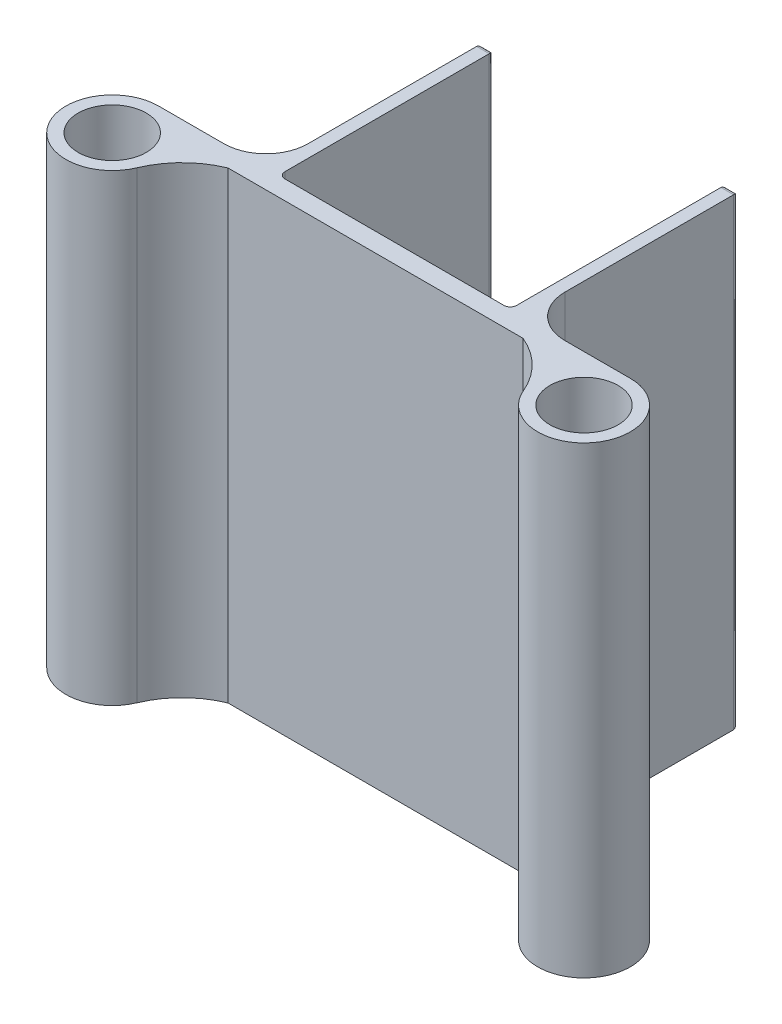
ISO-10303-21;
HEADER;
FILE_DESCRIPTION(('STEP AP214'),'2;1');
FILE_NAME('part.step','',(''),(''),'','','');
FILE_SCHEMA(('AUTOMOTIVE_DESIGN { 1 0 10303 214 1 1 1 1 }'));
ENDSEC;
DATA;
#1=APPLICATION_CONTEXT('core data for automotive mechanical design processes');
#2=APPLICATION_PROTOCOL_DEFINITION('international standard','automotive_design',2000,#1);
#3=PRODUCT_CONTEXT('',#1,'mechanical');
#4=PRODUCT('Part','Part','',(#3));
#5=PRODUCT_RELATED_PRODUCT_CATEGORY('part','',(#4));
#6=PRODUCT_DEFINITION_FORMATION('','',#4);
#7=PRODUCT_DEFINITION_CONTEXT('part definition',#1,'design');
#8=PRODUCT_DEFINITION('design','',#6,#7);
#9=PRODUCT_DEFINITION_SHAPE('','',#8);
#10=(LENGTH_UNIT() NAMED_UNIT(*) SI_UNIT(.MILLI.,.METRE.));
#11=(NAMED_UNIT(*) PLANE_ANGLE_UNIT() SI_UNIT($,.RADIAN.));
#12=(NAMED_UNIT(*) SI_UNIT($,.STERADIAN.) SOLID_ANGLE_UNIT());
#13=UNCERTAINTY_MEASURE_WITH_UNIT(LENGTH_MEASURE(1.E-05),#10,'distance_accuracy_value','');
#14=(GEOMETRIC_REPRESENTATION_CONTEXT(3) GLOBAL_UNCERTAINTY_ASSIGNED_CONTEXT((#13)) GLOBAL_UNIT_ASSIGNED_CONTEXT((#10,
#11,#12)) REPRESENTATION_CONTEXT('',''));
#15=CARTESIAN_POINT('',(0.,0.,0.));
#16=DIRECTION('',(0.,0.,1.));
#17=DIRECTION('',(1.,0.,0.));
#18=AXIS2_PLACEMENT_3D('',#15,#16,#17);
#19=CARTESIAN_POINT('',(0.,130.,-11.));
#20=DIRECTION('',(0.,0.,-1.));
#21=DIRECTION('',(-1.,0.,0.));
#22=AXIS2_PLACEMENT_3D('',#19,#20,#21);
#23=PLANE('',#22);
#24=DIRECTION('',(-1.,0.,0.));
#25=VECTOR('',#24,1.);
#26=CARTESIAN_POINT('',(49.2651427330391,121.,-11.));
#27=LINE('',#26,#25);
#28=CARTESIAN_POINT('',(19.2651427330391,121.,-11.));
#29=VERTEX_POINT('',#28);
#30=CARTESIAN_POINT('',(-32.7348572669609,121.,-11.));
#31=VERTEX_POINT('',#30);
#32=EDGE_CURVE('E256',#29,#31,#27,.T.);
#33=ORIENTED_EDGE('',*,*,#32,.F.);
#34=DIRECTION('',(0.,1.,0.));
#35=VECTOR('',#34,1.);
#36=CARTESIAN_POINT('',(19.2651427330391,130.,-11.));
#37=LINE('',#36,#35);
#38=CARTESIAN_POINT('',(19.2651427330391,11.,-11.));
#39=VERTEX_POINT('',#38);
#40=EDGE_CURVE('E309',#29,#39,#37,.F.);
#41=ORIENTED_EDGE('',*,*,#40,.T.);
#42=DIRECTION('',(1.,0.,0.));
#43=VECTOR('',#42,1.);
#44=CARTESIAN_POINT('',(-62.7348572669609,11.,-11.));
#45=LINE('',#44,#43);
#46=CARTESIAN_POINT('',(-32.7348572669609,11.,-11.));
#47=VERTEX_POINT('',#46);
#48=EDGE_CURVE('E237',#47,#39,#45,.T.);
#49=ORIENTED_EDGE('',*,*,#48,.F.);
#50=DIRECTION('',(0.,-1.,0.));
#51=VECTOR('',#50,1.);
#52=CARTESIAN_POINT('',(-32.7348572669609,130.,-11.));
#53=LINE('',#52,#51);
#54=EDGE_CURVE('E306',#47,#31,#53,.F.);
#55=ORIENTED_EDGE('',*,*,#54,.T.);
#56=EDGE_LOOP('',(#33,#41,#49,#55));
#57=FACE_BOUND('',#56,.T.);
#58=ADVANCED_FACE('F43',(#57),#23,.T.);
#59=CARTESIAN_POINT('',(-47.2348572669609,121.,-11.));
#60=VERTEX_POINT('',#59);
#61=CARTESIAN_POINT('',(-62.7348572669609,121.,-11.));
#62=VERTEX_POINT('',#61);
#63=EDGE_CURVE('E250',#60,#62,#27,.T.);
#64=ORIENTED_EDGE('',*,*,#63,.F.);
#65=DIRECTION('',(0.,-1.,0.));
#66=VECTOR('',#65,1.);
#67=CARTESIAN_POINT('',(-47.2348572669609,11.,-11.));
#68=LINE('',#67,#66);
#69=CARTESIAN_POINT('',(-47.2348572669609,11.,-11.));
#70=VERTEX_POINT('',#69);
#71=EDGE_CURVE('E272',#60,#70,#68,.T.);
#72=ORIENTED_EDGE('',*,*,#71,.T.);
#73=CARTESIAN_POINT('',(-62.7348572669609,11.,-11.));
#74=VERTEX_POINT('',#73);
#75=EDGE_CURVE('E232',#74,#70,#45,.T.);
#76=ORIENTED_EDGE('',*,*,#75,.F.);
#77=DIRECTION('',(0.,-1.,0.));
#78=VECTOR('',#77,1.);
#79=CARTESIAN_POINT('',(-62.7348572669609,130.,-11.));
#80=LINE('',#79,#78);
#81=EDGE_CURVE('E255',#62,#74,#80,.T.);
#82=ORIENTED_EDGE('',*,*,#81,.F.);
#83=EDGE_LOOP('',(#64,#72,#76,#82));
#84=FACE_BOUND('',#83,.T.);
#85=ADVANCED_FACE('F487',(#84),#23,.T.);
#86=CARTESIAN_POINT('',(-62.7348572669609,121.,0.));
#87=DIRECTION('',(0.,1.,0.));
#88=DIRECTION('',(0.,0.,1.));
#89=AXIS2_PLACEMENT_3D('',#86,#87,#88);
#90=PLANE('',#89);
#91=CARTESIAN_POINT('',(-62.7348572669609,121.,0.));
#92=DIRECTION('',(0.,1.,0.));
#93=DIRECTION('',(0.,0.,1.));
#94=AXIS2_PLACEMENT_3D('',#91,#92,#93);
#95=CIRCLE('',#94,8.1);
#96=CARTESIAN_POINT('',(-62.7348572669609,121.,8.1));
#97=VERTEX_POINT('',#96);
#98=EDGE_CURVE('E207',#97,#97,#95,.T.);
#99=ORIENTED_EDGE('',*,*,#98,.F.);
#100=EDGE_LOOP('',(#99));
#101=FACE_BOUND('',#100,.T.);
#102=CARTESIAN_POINT('',(49.2651427330391,121.,0.));
#103=DIRECTION('',(0.,1.,0.));
#104=DIRECTION('',(0.,0.,1.));
#105=AXIS2_PLACEMENT_3D('',#102,#103,#104);
#106=CIRCLE('',#105,8.1);
#107=CARTESIAN_POINT('',(49.2651427330391,121.,8.1));
#108=VERTEX_POINT('',#107);
#109=EDGE_CURVE('E432',#108,#108,#106,.T.);
#110=ORIENTED_EDGE('',*,*,#109,.F.);
#111=EDGE_LOOP('',(#110));
#112=FACE_BOUND('',#111,.T.);
#113=DIRECTION('',(0.,0.,1.));
#114=VECTOR('',#113,1.);
#115=CARTESIAN_POINT('',(-34.2348572669609,121.,-62.));
#116=LINE('',#115,#114);
#117=CARTESIAN_POINT('',(-34.2348572669609,121.,-61.));
#118=VERTEX_POINT('',#117);
#119=CARTESIAN_POINT('',(-34.2348572669609,121.,-12.5));
#120=VERTEX_POINT('',#119);
#121=EDGE_CURVE('E828',#118,#120,#116,.T.);
#122=ORIENTED_EDGE('',*,*,#121,.F.);
#123=DIRECTION('',(1.,0.,0.));
#124=VECTOR('',#123,1.);
#125=CARTESIAN_POINT('',(-62.7348572669609,121.,-61.));
#126=LINE('',#125,#124);
#127=CARTESIAN_POINT('',(-37.2348572669609,121.,-61.));
#128=VERTEX_POINT('',#127);
#129=EDGE_CURVE('E354',#118,#128,#126,.F.);
#130=ORIENTED_EDGE('',*,*,#129,.T.);
#131=DIRECTION('',(0.,0.,1.));
#132=VECTOR('',#131,1.);
#133=CARTESIAN_POINT('',(-37.2348572669609,121.,-62.));
#134=LINE('',#133,#132);
#135=CARTESIAN_POINT('',(-37.2348572669609,121.,-21.));
#136=VERTEX_POINT('',#135);
#137=EDGE_CURVE('E465',#128,#136,#134,.T.);
#138=ORIENTED_EDGE('',*,*,#137,.T.);
#139=CARTESIAN_POINT('',(-47.2348572669609,121.,-21.));
#140=DIRECTION('',(0.,1.,0.));
#141=DIRECTION('',(0.,0.,1.));
#142=AXIS2_PLACEMENT_3D('',#139,#140,#141);
#143=CIRCLE('',#142,10.);
#144=EDGE_CURVE('E292',#136,#60,#143,.F.);
#145=ORIENTED_EDGE('',*,*,#144,.T.);
#146=ORIENTED_EDGE('',*,*,#63,.T.);
#147=CARTESIAN_POINT('',(-62.7348572669609,121.,0.));
#148=DIRECTION('',(0.,1.,0.));
#149=DIRECTION('',(0.,0.,1.));
#150=AXIS2_PLACEMENT_3D('',#147,#148,#149);
#151=CIRCLE('',#150,11.);
#152=CARTESIAN_POINT('',(-52.5924272535725,121.,4.25806451612903));
#153=VERTEX_POINT('',#152);
#154=EDGE_CURVE('E236',#62,#153,#151,.T.);
#155=ORIENTED_EDGE('',*,*,#154,.T.);
#156=CARTESIAN_POINT('',(-34.151645411048,121.,12.));
#157=DIRECTION('',(0.,-1.,0.));
#158=DIRECTION('',(0.,0.,1.));
#159=AXIS2_PLACEMENT_3D('',#156,#157,#158);
#160=CIRCLE('',#159,20.);
#161=CARTESIAN_POINT('',(-41.7509874878334,121.,-6.5));
#162=VERTEX_POINT('',#161);
#163=EDGE_CURVE('E241',#153,#162,#160,.T.);
#164=ORIENTED_EDGE('',*,*,#163,.T.);
#165=DIRECTION('',(-1.,0.,0.));
#166=VECTOR('',#165,1.);
#167=CARTESIAN_POINT('',(0.,121.,-6.5));
#168=LINE('',#167,#166);
#169=CARTESIAN_POINT('',(28.2812729539115,121.,-6.5));
#170=VERTEX_POINT('',#169);
#171=EDGE_CURVE('E211',#170,#162,#168,.T.);
#172=ORIENTED_EDGE('',*,*,#171,.F.);
#173=CARTESIAN_POINT('',(20.6819308771262,121.,12.));
#174=DIRECTION('',(0.,-1.,0.));
#175=DIRECTION('',(0.,0.,1.));
#176=AXIS2_PLACEMENT_3D('',#173,#174,#175);
#177=CIRCLE('',#176,20.);
#178=CARTESIAN_POINT('',(39.1227127196506,121.,4.25806451612903));
#179=VERTEX_POINT('',#178);
#180=EDGE_CURVE('E244',#170,#179,#177,.T.);
#181=ORIENTED_EDGE('',*,*,#180,.T.);
#182=CARTESIAN_POINT('',(49.2651427330391,121.,0.));
#183=DIRECTION('',(0.,1.,0.));
#184=DIRECTION('',(0.,0.,1.));
#185=AXIS2_PLACEMENT_3D('',#182,#183,#184);
#186=CIRCLE('',#185,11.);
#187=CARTESIAN_POINT('',(49.2651427330391,121.,-11.));
#188=VERTEX_POINT('',#187);
#189=EDGE_CURVE('E247',#179,#188,#186,.T.);
#190=ORIENTED_EDGE('',*,*,#189,.T.);
#191=CARTESIAN_POINT('',(33.7651427330391,121.,-11.));
#192=VERTEX_POINT('',#191);
#193=EDGE_CURVE('E251',#188,#192,#27,.T.);
#194=ORIENTED_EDGE('',*,*,#193,.T.);
#195=CARTESIAN_POINT('',(33.7651427330391,121.,-21.));
#196=DIRECTION('',(0.,1.,0.));
#197=DIRECTION('',(0.,0.,1.));
#198=AXIS2_PLACEMENT_3D('',#195,#196,#197);
#199=CIRCLE('',#198,10.);
#200=CARTESIAN_POINT('',(23.7651427330391,121.,-21.));
#201=VERTEX_POINT('',#200);
#202=EDGE_CURVE('E295',#192,#201,#199,.F.);
#203=ORIENTED_EDGE('',*,*,#202,.T.);
#204=DIRECTION('',(0.,0.,1.));
#205=VECTOR('',#204,1.);
#206=CARTESIAN_POINT('',(23.7651427330391,121.,-62.));
#207=LINE('',#206,#205);
#208=CARTESIAN_POINT('',(23.7651427330391,121.,-61.));
#209=VERTEX_POINT('',#208);
#210=EDGE_CURVE('E461',#209,#201,#207,.T.);
#211=ORIENTED_EDGE('',*,*,#210,.F.);
#212=DIRECTION('',(1.,0.,0.));
#213=VECTOR('',#212,1.);
#214=CARTESIAN_POINT('',(-62.7348572669609,121.,-61.));
#215=LINE('',#214,#213);
#216=CARTESIAN_POINT('',(20.7651427330391,121.,-61.));
#217=VERTEX_POINT('',#216);
#218=EDGE_CURVE('E350',#209,#217,#215,.F.);
#219=ORIENTED_EDGE('',*,*,#218,.T.);
#220=DIRECTION('',(0.,0.,1.));
#221=VECTOR('',#220,1.);
#222=CARTESIAN_POINT('',(20.7651427330391,121.,-62.));
#223=LINE('',#222,#221);
#224=CARTESIAN_POINT('',(20.7651427330391,121.,-12.5));
#225=VERTEX_POINT('',#224);
#226=EDGE_CURVE('E426',#217,#225,#223,.T.);
#227=ORIENTED_EDGE('',*,*,#226,.T.);
#228=CARTESIAN_POINT('',(19.2651427330391,121.,-12.5));
#229=DIRECTION('',(0.,1.,0.));
#230=DIRECTION('',(0.,0.,1.));
#231=AXIS2_PLACEMENT_3D('',#228,#229,#230);
#232=CIRCLE('',#231,1.5);
#233=EDGE_CURVE('E316',#225,#29,#232,.F.);
#234=ORIENTED_EDGE('',*,*,#233,.T.);
#235=ORIENTED_EDGE('',*,*,#32,.T.);
#236=CARTESIAN_POINT('',(-32.7348572669609,121.,-12.5));
#237=DIRECTION('',(0.,1.,0.));
#238=DIRECTION('',(0.,0.,1.));
#239=AXIS2_PLACEMENT_3D('',#236,#237,#238);
#240=CIRCLE('',#239,1.5);
#241=EDGE_CURVE('E326',#31,#120,#240,.F.);
#242=ORIENTED_EDGE('',*,*,#241,.T.);
#243=EDGE_LOOP('',(#122,#130,#138,#145,#146,#155,#164,#172,#181,#190,#194,#203,#211,#219,#227,
#234,#235,#242));
#244=FACE_BOUND('',#243,.T.);
#245=ADVANCED_FACE('F455',(#101,#112,#244),#90,.T.);
#246=CARTESIAN_POINT('',(-6.73485726696093,11.,-39.));
#247=DIRECTION('',(0.,-1.,0.));
#248=DIRECTION('',(0.,0.,-1.));
#249=AXIS2_PLACEMENT_3D('',#246,#247,#248);
#250=PLANE('',#249);
#251=CARTESIAN_POINT('',(-62.7348572669609,11.,0.));
#252=DIRECTION('',(0.,-1.,0.));
#253=DIRECTION('',(0.,0.,-1.));
#254=AXIS2_PLACEMENT_3D('',#251,#252,#253);
#255=CIRCLE('',#254,8.1);
#256=CARTESIAN_POINT('',(-62.7348572669609,11.,-8.1));
#257=VERTEX_POINT('',#256);
#258=EDGE_CURVE('E424',#257,#257,#255,.T.);
#259=ORIENTED_EDGE('',*,*,#258,.F.);
#260=EDGE_LOOP('',(#259));
#261=FACE_BOUND('',#260,.T.);
#262=CARTESIAN_POINT('',(49.2651427330391,11.,0.));
#263=DIRECTION('',(0.,-1.,0.));
#264=DIRECTION('',(0.,0.,-1.));
#265=AXIS2_PLACEMENT_3D('',#262,#263,#264);
#266=CIRCLE('',#265,8.1);
#267=CARTESIAN_POINT('',(49.2651427330391,11.,-8.1));
#268=VERTEX_POINT('',#267);
#269=EDGE_CURVE('E419',#268,#268,#266,.T.);
#270=ORIENTED_EDGE('',*,*,#269,.F.);
#271=EDGE_LOOP('',(#270));
#272=FACE_BOUND('',#271,.T.);
#273=DIRECTION('',(0.,0.,1.));
#274=VECTOR('',#273,1.);
#275=CARTESIAN_POINT('',(-37.2348572669609,11.,-62.));
#276=LINE('',#275,#274);
#277=CARTESIAN_POINT('',(-37.2348572669609,11.,-61.));
#278=VERTEX_POINT('',#277);
#279=CARTESIAN_POINT('',(-37.2348572669609,11.,-21.));
#280=VERTEX_POINT('',#279);
#281=EDGE_CURVE('E389',#278,#280,#276,.T.);
#282=ORIENTED_EDGE('',*,*,#281,.F.);
#283=DIRECTION('',(-1.,0.,0.));
#284=VECTOR('',#283,1.);
#285=CARTESIAN_POINT('',(-6.73485726696093,11.,-61.));
#286=LINE('',#285,#284);
#287=CARTESIAN_POINT('',(-34.2348572669609,11.,-61.));
#288=VERTEX_POINT('',#287);
#289=EDGE_CURVE('E346',#278,#288,#286,.F.);
#290=ORIENTED_EDGE('',*,*,#289,.T.);
#291=DIRECTION('',(0.,0.,1.));
#292=VECTOR('',#291,1.);
#293=CARTESIAN_POINT('',(-34.2348572669609,11.,-62.));
#294=LINE('',#293,#292);
#295=CARTESIAN_POINT('',(-34.2348572669609,11.,-12.5));
#296=VERTEX_POINT('',#295);
#297=EDGE_CURVE('E823',#288,#296,#294,.T.);
#298=ORIENTED_EDGE('',*,*,#297,.T.);
#299=CARTESIAN_POINT('',(-32.7348572669609,11.,-12.5));
#300=DIRECTION('',(0.,-1.,0.));
#301=DIRECTION('',(0.,0.,-1.));
#302=AXIS2_PLACEMENT_3D('',#299,#300,#301);
#303=CIRCLE('',#302,1.5);
#304=EDGE_CURVE('E323',#296,#47,#303,.F.);
#305=ORIENTED_EDGE('',*,*,#304,.T.);
#306=ORIENTED_EDGE('',*,*,#48,.T.);
#307=CARTESIAN_POINT('',(19.2651427330391,11.,-12.5));
#308=DIRECTION('',(0.,-1.,0.));
#309=DIRECTION('',(0.,0.,-1.));
#310=AXIS2_PLACEMENT_3D('',#307,#308,#309);
#311=CIRCLE('',#310,1.5);
#312=CARTESIAN_POINT('',(20.7651427330391,11.,-12.5));
#313=VERTEX_POINT('',#312);
#314=EDGE_CURVE('E319',#39,#313,#311,.F.);
#315=ORIENTED_EDGE('',*,*,#314,.T.);
#316=DIRECTION('',(0.,0.,1.));
#317=VECTOR('',#316,1.);
#318=CARTESIAN_POINT('',(20.7651427330391,11.,-62.));
#319=LINE('',#318,#317);
#320=CARTESIAN_POINT('',(20.7651427330391,11.,-61.));
#321=VERTEX_POINT('',#320);
#322=EDGE_CURVE('E412',#321,#313,#319,.T.);
#323=ORIENTED_EDGE('',*,*,#322,.F.);
#324=DIRECTION('',(-1.,0.,0.));
#325=VECTOR('',#324,1.);
#326=CARTESIAN_POINT('',(-6.73485726696093,11.,-61.));
#327=LINE('',#326,#325);
#328=CARTESIAN_POINT('',(23.7651427330391,11.,-61.));
#329=VERTEX_POINT('',#328);
#330=EDGE_CURVE('E343',#321,#329,#327,.F.);
#331=ORIENTED_EDGE('',*,*,#330,.T.);
#332=DIRECTION('',(0.,0.,1.));
#333=VECTOR('',#332,1.);
#334=CARTESIAN_POINT('',(23.7651427330391,11.,-62.));
#335=LINE('',#334,#333);
#336=CARTESIAN_POINT('',(23.7651427330391,11.,-21.));
#337=VERTEX_POINT('',#336);
#338=EDGE_CURVE('E411',#329,#337,#335,.T.);
#339=ORIENTED_EDGE('',*,*,#338,.T.);
#340=CARTESIAN_POINT('',(33.7651427330391,11.,-21.));
#341=DIRECTION('',(0.,-1.,0.));
#342=DIRECTION('',(0.,0.,-1.));
#343=AXIS2_PLACEMENT_3D('',#340,#341,#342);
#344=CIRCLE('',#343,10.);
#345=CARTESIAN_POINT('',(33.7651427330391,11.,-11.));
#346=VERTEX_POINT('',#345);
#347=EDGE_CURVE('E299',#337,#346,#344,.F.);
#348=ORIENTED_EDGE('',*,*,#347,.T.);
#349=CARTESIAN_POINT('',(49.2651427330391,11.,-11.));
#350=VERTEX_POINT('',#349);
#351=EDGE_CURVE('E226',#346,#350,#45,.T.);
#352=ORIENTED_EDGE('',*,*,#351,.T.);
#353=CARTESIAN_POINT('',(49.2651427330391,11.,0.));
#354=DIRECTION('',(0.,-1.,0.));
#355=DIRECTION('',(0.,0.,-1.));
#356=AXIS2_PLACEMENT_3D('',#353,#354,#355);
#357=CIRCLE('',#356,11.);
#358=CARTESIAN_POINT('',(39.1227127196506,11.,4.25806451612903));
#359=VERTEX_POINT('',#358);
#360=EDGE_CURVE('E228',#350,#359,#357,.T.);
#361=ORIENTED_EDGE('',*,*,#360,.T.);
#362=CARTESIAN_POINT('',(20.6819308771262,11.,12.));
#363=DIRECTION('',(0.,1.,0.));
#364=DIRECTION('',(0.,0.,-1.));
#365=AXIS2_PLACEMENT_3D('',#362,#363,#364);
#366=CIRCLE('',#365,20.);
#367=CARTESIAN_POINT('',(28.2812729539115,11.,-6.5));
#368=VERTEX_POINT('',#367);
#369=EDGE_CURVE('E201',#359,#368,#366,.T.);
#370=ORIENTED_EDGE('',*,*,#369,.T.);
#371=DIRECTION('',(1.,0.,0.));
#372=VECTOR('',#371,1.);
#373=CARTESIAN_POINT('',(37.0455724304583,11.,-6.5));
#374=LINE('',#373,#372);
#375=CARTESIAN_POINT('',(-41.7509874878334,11.,-6.5));
#376=VERTEX_POINT('',#375);
#377=EDGE_CURVE('E193',#376,#368,#374,.T.);
#378=ORIENTED_EDGE('',*,*,#377,.F.);
#379=CARTESIAN_POINT('',(-34.151645411048,11.,12.));
#380=DIRECTION('',(0.,1.,0.));
#381=DIRECTION('',(0.,0.,-1.));
#382=AXIS2_PLACEMENT_3D('',#379,#380,#381);
#383=CIRCLE('',#382,20.);
#384=CARTESIAN_POINT('',(-52.5924272535725,11.,4.25806451612903));
#385=VERTEX_POINT('',#384);
#386=EDGE_CURVE('E198',#376,#385,#383,.T.);
#387=ORIENTED_EDGE('',*,*,#386,.T.);
#388=CARTESIAN_POINT('',(-62.7348572669609,11.,0.));
#389=DIRECTION('',(0.,-1.,0.));
#390=DIRECTION('',(0.,0.,-1.));
#391=AXIS2_PLACEMENT_3D('',#388,#389,#390);
#392=CIRCLE('',#391,11.);
#393=EDGE_CURVE('E222',#385,#74,#392,.T.);
#394=ORIENTED_EDGE('',*,*,#393,.T.);
#395=ORIENTED_EDGE('',*,*,#75,.T.);
#396=CARTESIAN_POINT('',(-47.2348572669609,11.,-21.));
#397=DIRECTION('',(0.,-1.,0.));
#398=DIRECTION('',(0.,0.,-1.));
#399=AXIS2_PLACEMENT_3D('',#396,#397,#398);
#400=CIRCLE('',#399,10.);
#401=EDGE_CURVE('E288',#70,#280,#400,.F.);
#402=ORIENTED_EDGE('',*,*,#401,.T.);
#403=EDGE_LOOP('',(#282,#290,#298,#305,#306,#315,#323,#331,#339,#348,#352,#361,#370,#378,#387,
#394,#395,#402));
#404=FACE_BOUND('',#403,.T.);
#405=ADVANCED_FACE('F196',(#261,#272,#404),#250,.T.);
#406=CARTESIAN_POINT('',(0.,0.,-6.5));
#407=DIRECTION('',(0.,0.,1.));
#408=DIRECTION('',(1.,0.,0.));
#409=AXIS2_PLACEMENT_3D('',#406,#407,#408);
#410=PLANE('',#409);
#411=DIRECTION('',(0.,-1.,0.));
#412=VECTOR('',#411,1.);
#413=CARTESIAN_POINT('',(-41.7509874878334,130.,-6.5));
#414=LINE('',#413,#412);
#415=EDGE_CURVE('E206',#376,#162,#414,.F.);
#416=ORIENTED_EDGE('',*,*,#415,.F.);
#417=ORIENTED_EDGE('',*,*,#377,.T.);
#418=DIRECTION('',(0.,-1.,0.));
#419=VECTOR('',#418,1.);
#420=CARTESIAN_POINT('',(28.2812729539115,130.,-6.5));
#421=LINE('',#420,#419);
#422=EDGE_CURVE('E216',#170,#368,#421,.T.);
#423=ORIENTED_EDGE('',*,*,#422,.F.);
#424=ORIENTED_EDGE('',*,*,#171,.T.);
#425=EDGE_LOOP('',(#416,#417,#423,#424));
#426=FACE_BOUND('',#425,.T.);
#427=ADVANCED_FACE('F210',(#426),#410,.T.);
#428=ORIENTED_EDGE('',*,*,#351,.F.);
#429=DIRECTION('',(0.,1.,0.));
#430=VECTOR('',#429,1.);
#431=CARTESIAN_POINT('',(33.7651427330391,121.,-11.));
#432=LINE('',#431,#430);
#433=EDGE_CURVE('E280',#346,#192,#432,.T.);
#434=ORIENTED_EDGE('',*,*,#433,.T.);
#435=ORIENTED_EDGE('',*,*,#193,.F.);
#436=DIRECTION('',(0.,-1.,0.));
#437=VECTOR('',#436,1.);
#438=CARTESIAN_POINT('',(49.2651427330391,130.,-11.));
#439=LINE('',#438,#437);
#440=EDGE_CURVE('E260',#188,#350,#439,.T.);
#441=ORIENTED_EDGE('',*,*,#440,.T.);
#442=EDGE_LOOP('',(#428,#434,#435,#441));
#443=FACE_BOUND('',#442,.T.);
#444=ADVANCED_FACE('F457',(#443),#23,.T.);
#445=CARTESIAN_POINT('',(-62.7348572669609,130.,0.));
#446=DIRECTION('',(0.,-1.,0.));
#447=DIRECTION('',(0.,0.,-1.));
#448=AXIS2_PLACEMENT_3D('',#445,#446,#447);
#449=CYLINDRICAL_SURFACE('',#448,11.);
#450=ORIENTED_EDGE('',*,*,#393,.F.);
#451=DIRECTION('',(0.,-1.,0.));
#452=VECTOR('',#451,1.);
#453=CARTESIAN_POINT('',(-52.5924272535725,130.,4.25806451612903));
#454=LINE('',#453,#452);
#455=EDGE_CURVE('E220',#385,#153,#454,.F.);
#456=ORIENTED_EDGE('',*,*,#455,.T.);
#457=ORIENTED_EDGE('',*,*,#154,.F.);
#458=ORIENTED_EDGE('',*,*,#81,.T.);
#459=EDGE_LOOP('',(#450,#456,#457,#458));
#460=FACE_BOUND('',#459,.T.);
#461=ADVANCED_FACE('F498',(#460),#449,.T.);
#462=CARTESIAN_POINT('',(49.2651427330391,130.,0.));
#463=DIRECTION('',(0.,-1.,0.));
#464=DIRECTION('',(0.,0.,-1.));
#465=AXIS2_PLACEMENT_3D('',#462,#463,#464);
#466=CYLINDRICAL_SURFACE('',#465,11.);
#467=ORIENTED_EDGE('',*,*,#360,.F.);
#468=ORIENTED_EDGE('',*,*,#440,.F.);
#469=ORIENTED_EDGE('',*,*,#189,.F.);
#470=DIRECTION('',(0.,-1.,0.));
#471=VECTOR('',#470,1.);
#472=CARTESIAN_POINT('',(39.1227127196506,130.,4.25806451612903));
#473=LINE('',#472,#471);
#474=EDGE_CURVE('E264',#179,#359,#473,.T.);
#475=ORIENTED_EDGE('',*,*,#474,.T.);
#476=EDGE_LOOP('',(#467,#468,#469,#475));
#477=FACE_BOUND('',#476,.T.);
#478=ADVANCED_FACE('F451',(#477),#466,.T.);
#479=CARTESIAN_POINT('',(20.6819308771262,130.,12.));
#480=DIRECTION('',(0.,-1.,0.));
#481=DIRECTION('',(0.,0.,-1.));
#482=AXIS2_PLACEMENT_3D('',#479,#480,#481);
#483=CYLINDRICAL_SURFACE('',#482,20.);
#484=ORIENTED_EDGE('',*,*,#180,.F.);
#485=ORIENTED_EDGE('',*,*,#422,.T.);
#486=ORIENTED_EDGE('',*,*,#369,.F.);
#487=ORIENTED_EDGE('',*,*,#474,.F.);
#488=EDGE_LOOP('',(#484,#485,#486,#487));
#489=FACE_BOUND('',#488,.T.);
#490=ADVANCED_FACE('F449',(#489),#483,.F.);
#491=CARTESIAN_POINT('',(-34.151645411048,130.,12.));
#492=DIRECTION('',(0.,-1.,0.));
#493=DIRECTION('',(0.,0.,-1.));
#494=AXIS2_PLACEMENT_3D('',#491,#492,#493);
#495=CYLINDRICAL_SURFACE('',#494,20.);
#496=ORIENTED_EDGE('',*,*,#386,.F.);
#497=ORIENTED_EDGE('',*,*,#415,.T.);
#498=ORIENTED_EDGE('',*,*,#163,.F.);
#499=ORIENTED_EDGE('',*,*,#455,.F.);
#500=EDGE_LOOP('',(#496,#497,#498,#499));
#501=FACE_BOUND('',#500,.T.);
#502=ADVANCED_FACE('F219',(#501),#495,.F.);
#503=CARTESIAN_POINT('',(49.2651427330391,146.,0.));
#504=DIRECTION('',(0.,-1.,0.));
#505=DIRECTION('',(0.,0.,-1.));
#506=AXIS2_PLACEMENT_3D('',#503,#504,#505);
#507=CYLINDRICAL_SURFACE('',#506,8.1);
#508=ORIENTED_EDGE('',*,*,#109,.T.);
#509=EDGE_LOOP('',(#508));
#510=FACE_BOUND('',#509,.T.);
#511=ORIENTED_EDGE('',*,*,#269,.T.);
#512=EDGE_LOOP('',(#511));
#513=FACE_BOUND('',#512,.T.);
#514=ADVANCED_FACE('F512',(#510,#513),#507,.F.);
#515=CARTESIAN_POINT('',(-62.7348572669609,146.,0.));
#516=DIRECTION('',(0.,-1.,0.));
#517=DIRECTION('',(0.,0.,-1.));
#518=AXIS2_PLACEMENT_3D('',#515,#516,#517);
#519=CYLINDRICAL_SURFACE('',#518,8.1);
#520=ORIENTED_EDGE('',*,*,#98,.T.);
#521=EDGE_LOOP('',(#520));
#522=FACE_BOUND('',#521,.T.);
#523=ORIENTED_EDGE('',*,*,#258,.T.);
#524=EDGE_LOOP('',(#523));
#525=FACE_BOUND('',#524,.T.);
#526=ADVANCED_FACE('F524',(#522,#525),#519,.F.);
#527=CARTESIAN_POINT('',(23.7651427330391,0.,-62.));
#528=DIRECTION('',(1.,0.,0.));
#529=DIRECTION('',(0.,0.,-1.));
#530=AXIS2_PLACEMENT_3D('',#527,#528,#529);
#531=PLANE('',#530);
#532=ORIENTED_EDGE('',*,*,#338,.F.);
#533=DIRECTION('',(0.,1.,0.));
#534=VECTOR('',#533,1.);
#535=CARTESIAN_POINT('',(23.7651427330391,0.,-61.));
#536=LINE('',#535,#534);
#537=EDGE_CURVE('E11',#329,#209,#536,.T.);
#538=ORIENTED_EDGE('',*,*,#537,.T.);
#539=ORIENTED_EDGE('',*,*,#210,.T.);
#540=DIRECTION('',(0.,1.,0.));
#541=VECTOR('',#540,1.);
#542=CARTESIAN_POINT('',(23.7651427330391,11.,-21.));
#543=LINE('',#542,#541);
#544=EDGE_CURVE('E284',#201,#337,#543,.F.);
#545=ORIENTED_EDGE('',*,*,#544,.T.);
#546=EDGE_LOOP('',(#532,#538,#539,#545));
#547=FACE_BOUND('',#546,.T.);
#548=ADVANCED_FACE('F414',(#547),#531,.T.);
#549=CARTESIAN_POINT('',(20.7651427330391,0.,-62.));
#550=DIRECTION('',(1.,0.,0.));
#551=DIRECTION('',(0.,0.,-1.));
#552=AXIS2_PLACEMENT_3D('',#549,#550,#551);
#553=PLANE('',#552);
#554=ORIENTED_EDGE('',*,*,#226,.F.);
#555=DIRECTION('',(0.,1.,0.));
#556=VECTOR('',#555,1.);
#557=CARTESIAN_POINT('',(20.7651427330391,11.,-61.));
#558=LINE('',#557,#556);
#559=EDGE_CURVE('E53',#217,#321,#558,.F.);
#560=ORIENTED_EDGE('',*,*,#559,.T.);
#561=ORIENTED_EDGE('',*,*,#322,.T.);
#562=DIRECTION('',(0.,1.,0.));
#563=VECTOR('',#562,1.);
#564=CARTESIAN_POINT('',(20.7651427330391,0.,-12.5));
#565=LINE('',#564,#563);
#566=EDGE_CURVE('E302',#313,#225,#565,.T.);
#567=ORIENTED_EDGE('',*,*,#566,.T.);
#568=EDGE_LOOP('',(#554,#560,#561,#567));
#569=FACE_BOUND('',#568,.T.);
#570=ADVANCED_FACE('F475',(#569),#553,.F.);
#571=CARTESIAN_POINT('',(0.,0.,-62.));
#572=DIRECTION('',(0.,0.,-1.));
#573=DIRECTION('',(-1.,0.,0.));
#574=AXIS2_PLACEMENT_3D('',#571,#572,#573);
#575=PLANE('',#574);
#576=DIRECTION('',(-1.,0.,0.));
#577=VECTOR('',#576,1.);
#578=CARTESIAN_POINT('',(0.,12.,-62.));
#579=LINE('',#578,#577);
#580=CARTESIAN_POINT('',(22.7651427330391,12.,-62.));
#581=VERTEX_POINT('',#580);
#582=CARTESIAN_POINT('',(21.7651427330391,12.,-62.));
#583=VERTEX_POINT('',#582);
#584=EDGE_CURVE('E66',#581,#583,#579,.T.);
#585=ORIENTED_EDGE('',*,*,#584,.T.);
#586=DIRECTION('',(0.,1.,0.));
#587=VECTOR('',#586,1.);
#588=CARTESIAN_POINT('',(21.7651427330391,121.,-62.));
#589=LINE('',#588,#587);
#590=CARTESIAN_POINT('',(21.7651427330391,120.,-62.));
#591=VERTEX_POINT('',#590);
#592=EDGE_CURVE('E61',#583,#591,#589,.T.);
#593=ORIENTED_EDGE('',*,*,#592,.T.);
#594=DIRECTION('',(1.,0.,0.));
#595=VECTOR('',#594,1.);
#596=CARTESIAN_POINT('',(0.,120.,-62.));
#597=LINE('',#596,#595);
#598=CARTESIAN_POINT('',(22.7651427330391,120.,-62.));
#599=VERTEX_POINT('',#598);
#600=EDGE_CURVE('E362',#591,#599,#597,.T.);
#601=ORIENTED_EDGE('',*,*,#600,.T.);
#602=DIRECTION('',(0.,1.,0.));
#603=VECTOR('',#602,1.);
#604=CARTESIAN_POINT('',(22.7651427330391,0.,-62.));
#605=LINE('',#604,#603);
#606=EDGE_CURVE('E357',#599,#581,#605,.F.);
#607=ORIENTED_EDGE('',*,*,#606,.T.);
#608=EDGE_LOOP('',(#585,#593,#601,#607));
#609=FACE_BOUND('',#608,.T.);
#610=ADVANCED_FACE('F472',(#609),#575,.T.);
#611=CARTESIAN_POINT('',(-37.2348572669609,0.,-62.));
#612=DIRECTION('',(-1.,0.,0.));
#613=DIRECTION('',(0.,0.,1.));
#614=AXIS2_PLACEMENT_3D('',#611,#612,#613);
#615=PLANE('',#614);
#616=ORIENTED_EDGE('',*,*,#137,.F.);
#617=DIRECTION('',(0.,-1.,0.));
#618=VECTOR('',#617,1.);
#619=CARTESIAN_POINT('',(-37.2348572669609,0.,-61.));
#620=LINE('',#619,#618);
#621=EDGE_CURVE('E367',#128,#278,#620,.T.);
#622=ORIENTED_EDGE('',*,*,#621,.T.);
#623=ORIENTED_EDGE('',*,*,#281,.T.);
#624=DIRECTION('',(0.,-1.,0.));
#625=VECTOR('',#624,1.);
#626=CARTESIAN_POINT('',(-37.2348572669609,121.,-21.));
#627=LINE('',#626,#625);
#628=EDGE_CURVE('E276',#280,#136,#627,.F.);
#629=ORIENTED_EDGE('',*,*,#628,.T.);
#630=EDGE_LOOP('',(#616,#622,#623,#629));
#631=FACE_BOUND('',#630,.T.);
#632=ADVANCED_FACE('F474',(#631),#615,.T.);
#633=CARTESIAN_POINT('',(-34.2348572669609,0.,-62.));
#634=DIRECTION('',(-1.,0.,0.));
#635=DIRECTION('',(0.,0.,1.));
#636=AXIS2_PLACEMENT_3D('',#633,#634,#635);
#637=PLANE('',#636);
#638=ORIENTED_EDGE('',*,*,#297,.F.);
#639=DIRECTION('',(0.,-1.,0.));
#640=VECTOR('',#639,1.);
#641=CARTESIAN_POINT('',(-34.2348572669609,121.,-61.));
#642=LINE('',#641,#640);
#643=EDGE_CURVE('E370',#288,#118,#642,.F.);
#644=ORIENTED_EDGE('',*,*,#643,.T.);
#645=ORIENTED_EDGE('',*,*,#121,.T.);
#646=DIRECTION('',(0.,-1.,0.));
#647=VECTOR('',#646,1.);
#648=CARTESIAN_POINT('',(-34.2348572669609,0.,-12.5));
#649=LINE('',#648,#647);
#650=EDGE_CURVE('E312',#120,#296,#649,.T.);
#651=ORIENTED_EDGE('',*,*,#650,.T.);
#652=EDGE_LOOP('',(#638,#644,#645,#651));
#653=FACE_BOUND('',#652,.T.);
#654=ADVANCED_FACE('F481',(#653),#637,.F.);
#655=CARTESIAN_POINT('',(0.,0.,-62.));
#656=DIRECTION('',(0.,0.,-1.));
#657=DIRECTION('',(-1.,0.,0.));
#658=AXIS2_PLACEMENT_3D('',#655,#656,#657);
#659=PLANE('',#658);
#660=DIRECTION('',(-1.,0.,0.));
#661=VECTOR('',#660,1.);
#662=CARTESIAN_POINT('',(0.,12.,-62.));
#663=LINE('',#662,#661);
#664=CARTESIAN_POINT('',(-35.2348572669609,12.,-62.));
#665=VERTEX_POINT('',#664);
#666=CARTESIAN_POINT('',(-36.2348572669609,12.,-62.));
#667=VERTEX_POINT('',#666);
#668=EDGE_CURVE('E336',#665,#667,#663,.T.);
#669=ORIENTED_EDGE('',*,*,#668,.T.);
#670=DIRECTION('',(0.,-1.,0.));
#671=VECTOR('',#670,1.);
#672=CARTESIAN_POINT('',(-36.2348572669609,0.,-62.));
#673=LINE('',#672,#671);
#674=CARTESIAN_POINT('',(-36.2348572669609,120.,-62.));
#675=VERTEX_POINT('',#674);
#676=EDGE_CURVE('E340',#667,#675,#673,.F.);
#677=ORIENTED_EDGE('',*,*,#676,.T.);
#678=DIRECTION('',(1.,0.,0.));
#679=VECTOR('',#678,1.);
#680=CARTESIAN_POINT('',(0.,120.,-62.));
#681=LINE('',#680,#679);
#682=CARTESIAN_POINT('',(-35.2348572669609,120.,-62.));
#683=VERTEX_POINT('',#682);
#684=EDGE_CURVE('E333',#675,#683,#681,.T.);
#685=ORIENTED_EDGE('',*,*,#684,.T.);
#686=DIRECTION('',(0.,-1.,0.));
#687=VECTOR('',#686,1.);
#688=CARTESIAN_POINT('',(-35.2348572669609,11.,-62.));
#689=LINE('',#688,#687);
#690=EDGE_CURVE('E330',#683,#665,#689,.T.);
#691=ORIENTED_EDGE('',*,*,#690,.T.);
#692=EDGE_LOOP('',(#669,#677,#685,#691));
#693=FACE_BOUND('',#692,.T.);
#694=ADVANCED_FACE('F541',(#693),#659,.T.);
#695=CARTESIAN_POINT('',(-47.2348572669609,130.,-21.));
#696=DIRECTION('',(0.,1.,0.));
#697=DIRECTION('',(0.,0.,1.));
#698=AXIS2_PLACEMENT_3D('',#695,#696,#697);
#699=CYLINDRICAL_SURFACE('',#698,10.);
#700=ORIENTED_EDGE('',*,*,#144,.F.);
#701=ORIENTED_EDGE('',*,*,#628,.F.);
#702=ORIENTED_EDGE('',*,*,#401,.F.);
#703=ORIENTED_EDGE('',*,*,#71,.F.);
#704=EDGE_LOOP('',(#700,#701,#702,#703));
#705=FACE_BOUND('',#704,.T.);
#706=ADVANCED_FACE('F538',(#705),#699,.F.);
#707=CARTESIAN_POINT('',(33.7651427330391,130.,-21.));
#708=DIRECTION('',(0.,-1.,0.));
#709=DIRECTION('',(0.,0.,-1.));
#710=AXIS2_PLACEMENT_3D('',#707,#708,#709);
#711=CYLINDRICAL_SURFACE('',#710,10.);
#712=ORIENTED_EDGE('',*,*,#347,.F.);
#713=ORIENTED_EDGE('',*,*,#544,.F.);
#714=ORIENTED_EDGE('',*,*,#202,.F.);
#715=ORIENTED_EDGE('',*,*,#433,.F.);
#716=EDGE_LOOP('',(#712,#713,#714,#715));
#717=FACE_BOUND('',#716,.T.);
#718=ADVANCED_FACE('F460',(#717),#711,.F.);
#719=CARTESIAN_POINT('',(19.2651427330391,0.,-12.5));
#720=DIRECTION('',(0.,1.,0.));
#721=DIRECTION('',(0.,0.,1.));
#722=AXIS2_PLACEMENT_3D('',#719,#720,#721);
#723=CYLINDRICAL_SURFACE('',#722,1.5);
#724=ORIENTED_EDGE('',*,*,#314,.F.);
#725=ORIENTED_EDGE('',*,*,#40,.F.);
#726=ORIENTED_EDGE('',*,*,#233,.F.);
#727=ORIENTED_EDGE('',*,*,#566,.F.);
#728=EDGE_LOOP('',(#724,#725,#726,#727));
#729=FACE_BOUND('',#728,.T.);
#730=ADVANCED_FACE('F545',(#729),#723,.F.);
#731=CARTESIAN_POINT('',(-32.7348572669609,0.,-12.5));
#732=DIRECTION('',(0.,-1.,0.));
#733=DIRECTION('',(0.,0.,-1.));
#734=AXIS2_PLACEMENT_3D('',#731,#732,#733);
#735=CYLINDRICAL_SURFACE('',#734,1.5);
#736=ORIENTED_EDGE('',*,*,#241,.F.);
#737=ORIENTED_EDGE('',*,*,#54,.F.);
#738=ORIENTED_EDGE('',*,*,#304,.F.);
#739=ORIENTED_EDGE('',*,*,#650,.F.);
#740=EDGE_LOOP('',(#736,#737,#738,#739));
#741=FACE_BOUND('',#740,.T.);
#742=ADVANCED_FACE('F548',(#741),#735,.F.);
#743=CARTESIAN_POINT('',(0.,120.,-61.));
#744=DIRECTION('',(1.,0.,0.));
#745=DIRECTION('',(0.,0.,-1.));
#746=AXIS2_PLACEMENT_3D('',#743,#744,#745);
#747=CYLINDRICAL_SURFACE('',#746,1.);
#748=CARTESIAN_POINT('',(-36.2348572669609,120.,-61.));
#749=DIRECTION('',(-0.707106781186547,-0.707106781186547,0.));
#750=DIRECTION('',(0.707106781186547,-0.707106781186547,0.));
#751=AXIS2_PLACEMENT_3D('',#748,#749,#750);
#752=ELLIPSE('',#751,1.41421356237309,1.);
#753=EDGE_CURVE('E381',#128,#675,#752,.T.);
#754=ORIENTED_EDGE('',*,*,#753,.F.);
#755=ORIENTED_EDGE('',*,*,#129,.F.);
#756=CARTESIAN_POINT('',(-35.2348572669609,120.,-61.));
#757=DIRECTION('',(-0.707106781186547,0.707106781186547,0.));
#758=DIRECTION('',(0.707106781186547,0.707106781186547,0.));
#759=AXIS2_PLACEMENT_3D('',#756,#757,#758);
#760=ELLIPSE('',#759,1.41421356237309,1.);
#761=EDGE_CURVE('E385',#683,#118,#760,.F.);
#762=ORIENTED_EDGE('',*,*,#761,.F.);
#763=ORIENTED_EDGE('',*,*,#684,.F.);
#764=EDGE_LOOP('',(#754,#755,#762,#763));
#765=FACE_BOUND('',#764,.T.);
#766=ADVANCED_FACE('F552',(#765),#747,.T.);
#767=CARTESIAN_POINT('',(-35.2348572669609,0.,-61.));
#768=DIRECTION('',(0.,1.,0.));
#769=DIRECTION('',(0.,0.,1.));
#770=AXIS2_PLACEMENT_3D('',#767,#768,#769);
#771=CYLINDRICAL_SURFACE('',#770,1.);
#772=ORIENTED_EDGE('',*,*,#761,.T.);
#773=ORIENTED_EDGE('',*,*,#643,.F.);
#774=CARTESIAN_POINT('',(-35.2348572669609,12.,-61.));
#775=DIRECTION('',(0.707106781186547,0.707106781186547,0.));
#776=DIRECTION('',(-0.707106781186547,0.707106781186547,0.));
#777=AXIS2_PLACEMENT_3D('',#774,#775,#776);
#778=ELLIPSE('',#777,1.41421356237309,1.);
#779=EDGE_CURVE('E378',#665,#288,#778,.F.);
#780=ORIENTED_EDGE('',*,*,#779,.F.);
#781=ORIENTED_EDGE('',*,*,#690,.F.);
#782=EDGE_LOOP('',(#772,#773,#780,#781));
#783=FACE_BOUND('',#782,.T.);
#784=ADVANCED_FACE('F561',(#783),#771,.T.);
#785=CARTESIAN_POINT('',(-36.2348572669609,0.,-61.));
#786=DIRECTION('',(0.,-1.,0.));
#787=DIRECTION('',(0.,0.,-1.));
#788=AXIS2_PLACEMENT_3D('',#785,#786,#787);
#789=CYLINDRICAL_SURFACE('',#788,1.);
#790=ORIENTED_EDGE('',*,*,#753,.T.);
#791=ORIENTED_EDGE('',*,*,#676,.F.);
#792=CARTESIAN_POINT('',(-36.2348572669609,12.,-61.));
#793=DIRECTION('',(0.707106781186547,-0.707106781186547,0.));
#794=DIRECTION('',(-0.707106781186547,-0.707106781186547,0.));
#795=AXIS2_PLACEMENT_3D('',#792,#793,#794);
#796=ELLIPSE('',#795,1.41421356237309,1.);
#797=EDGE_CURVE('E375',#278,#667,#796,.T.);
#798=ORIENTED_EDGE('',*,*,#797,.F.);
#799=ORIENTED_EDGE('',*,*,#621,.F.);
#800=EDGE_LOOP('',(#790,#791,#798,#799));
#801=FACE_BOUND('',#800,.T.);
#802=ADVANCED_FACE('F557',(#801),#789,.T.);
#803=CARTESIAN_POINT('',(0.,12.,-61.));
#804=DIRECTION('',(-1.,0.,0.));
#805=DIRECTION('',(0.,0.,1.));
#806=AXIS2_PLACEMENT_3D('',#803,#804,#805);
#807=CYLINDRICAL_SURFACE('',#806,1.);
#808=ORIENTED_EDGE('',*,*,#779,.T.);
#809=ORIENTED_EDGE('',*,*,#289,.F.);
#810=ORIENTED_EDGE('',*,*,#797,.T.);
#811=ORIENTED_EDGE('',*,*,#668,.F.);
#812=EDGE_LOOP('',(#808,#809,#810,#811));
#813=FACE_BOUND('',#812,.T.);
#814=ADVANCED_FACE('F554',(#813),#807,.T.);
#815=CARTESIAN_POINT('',(0.,12.,-61.));
#816=DIRECTION('',(-1.,0.,0.));
#817=DIRECTION('',(0.,0.,1.));
#818=AXIS2_PLACEMENT_3D('',#815,#816,#817);
#819=CYLINDRICAL_SURFACE('',#818,1.);
#820=CARTESIAN_POINT('',(22.7651427330391,12.,-61.));
#821=DIRECTION('',(0.707106781186547,0.707106781186547,0.));
#822=DIRECTION('',(-0.707106781186547,0.707106781186547,0.));
#823=AXIS2_PLACEMENT_3D('',#820,#821,#822);
#824=ELLIPSE('',#823,1.41421356237309,1.);
#825=EDGE_CURVE('E395',#329,#581,#824,.T.);
#826=ORIENTED_EDGE('',*,*,#825,.F.);
#827=ORIENTED_EDGE('',*,*,#330,.F.);
#828=CARTESIAN_POINT('',(21.7651427330391,12.,-61.));
#829=DIRECTION('',(0.707106781186547,-0.707106781186547,0.));
#830=DIRECTION('',(-0.707106781186547,-0.707106781186547,0.));
#831=AXIS2_PLACEMENT_3D('',#828,#829,#830);
#832=ELLIPSE('',#831,1.41421356237309,1.);
#833=EDGE_CURVE('E47',#583,#321,#832,.F.);
#834=ORIENTED_EDGE('',*,*,#833,.F.);
#835=ORIENTED_EDGE('',*,*,#584,.F.);
#836=EDGE_LOOP('',(#826,#827,#834,#835));
#837=FACE_BOUND('',#836,.T.);
#838=ADVANCED_FACE('F45',(#837),#819,.T.);
#839=CARTESIAN_POINT('',(21.7651427330391,0.,-61.));
#840=DIRECTION('',(0.,-1.,0.));
#841=DIRECTION('',(0.,0.,-1.));
#842=AXIS2_PLACEMENT_3D('',#839,#840,#841);
#843=CYLINDRICAL_SURFACE('',#842,1.);
#844=ORIENTED_EDGE('',*,*,#833,.T.);
#845=ORIENTED_EDGE('',*,*,#559,.F.);
#846=CARTESIAN_POINT('',(21.7651427330391,120.,-61.));
#847=DIRECTION('',(-0.707106781186547,-0.707106781186547,0.));
#848=DIRECTION('',(0.707106781186547,-0.707106781186547,0.));
#849=AXIS2_PLACEMENT_3D('',#846,#847,#848);
#850=ELLIPSE('',#849,1.41421356237309,1.);
#851=EDGE_CURVE('E393',#591,#217,#850,.F.);
#852=ORIENTED_EDGE('',*,*,#851,.F.);
#853=ORIENTED_EDGE('',*,*,#592,.F.);
#854=EDGE_LOOP('',(#844,#845,#852,#853));
#855=FACE_BOUND('',#854,.T.);
#856=ADVANCED_FACE('F406',(#855),#843,.T.);
#857=CARTESIAN_POINT('',(22.7651427330391,0.,-61.));
#858=DIRECTION('',(0.,1.,0.));
#859=DIRECTION('',(0.,0.,1.));
#860=AXIS2_PLACEMENT_3D('',#857,#858,#859);
#861=CYLINDRICAL_SURFACE('',#860,1.);
#862=ORIENTED_EDGE('',*,*,#825,.T.);
#863=ORIENTED_EDGE('',*,*,#606,.F.);
#864=CARTESIAN_POINT('',(22.7651427330391,120.,-61.));
#865=DIRECTION('',(-0.707106781186547,0.707106781186547,0.));
#866=DIRECTION('',(0.707106781186547,0.707106781186547,0.));
#867=AXIS2_PLACEMENT_3D('',#864,#865,#866);
#868=ELLIPSE('',#867,1.41421356237309,1.);
#869=EDGE_CURVE('E390',#209,#599,#868,.T.);
#870=ORIENTED_EDGE('',*,*,#869,.F.);
#871=ORIENTED_EDGE('',*,*,#537,.F.);
#872=EDGE_LOOP('',(#862,#863,#870,#871));
#873=FACE_BOUND('',#872,.T.);
#874=ADVANCED_FACE('F471',(#873),#861,.T.);
#875=CARTESIAN_POINT('',(0.,120.,-61.));
#876=DIRECTION('',(1.,0.,0.));
#877=DIRECTION('',(0.,0.,-1.));
#878=AXIS2_PLACEMENT_3D('',#875,#876,#877);
#879=CYLINDRICAL_SURFACE('',#878,1.);
#880=ORIENTED_EDGE('',*,*,#851,.T.);
#881=ORIENTED_EDGE('',*,*,#218,.F.);
#882=ORIENTED_EDGE('',*,*,#869,.T.);
#883=ORIENTED_EDGE('',*,*,#600,.F.);
#884=EDGE_LOOP('',(#880,#881,#882,#883));
#885=FACE_BOUND('',#884,.T.);
#886=ADVANCED_FACE('F469',(#885),#879,.T.);
#887=CLOSED_SHELL('',(#58,#85,#245,#405,#427,#444,#461,#478,#490,#502,#514,#526,#548,#570,#610,
#632,#654,#694,#706,#718,#730,#742,#766,#784,#802,#814,#838,#856,#874,#886));
#888=MANIFOLD_SOLID_BREP('B2',#887);
#889=ADVANCED_BREP_SHAPE_REPRESENTATION('',(#18,#888),#14);
#890=SHAPE_DEFINITION_REPRESENTATION(#9,#889);
ENDSEC;
END-ISO-10303-21;
